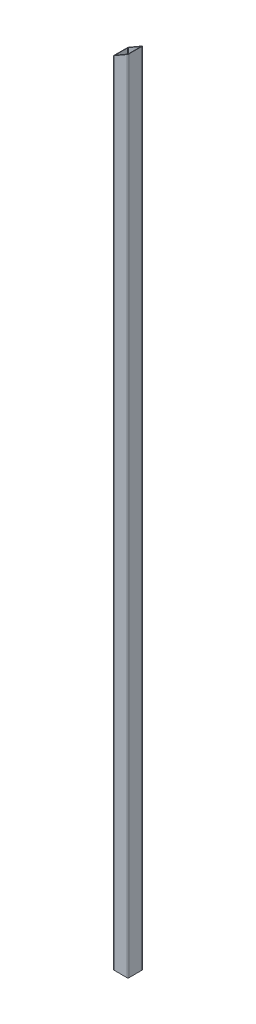
ISO-10303-21;
HEADER;
FILE_DESCRIPTION(('STEP AP214'),'2;1');
FILE_NAME('part.step','',(''),(''),'','','');
FILE_SCHEMA(('AUTOMOTIVE_DESIGN { 1 0 10303 214 1 1 1 1 }'));
ENDSEC;
DATA;
#1=APPLICATION_CONTEXT('core data for automotive mechanical design processes');
#2=APPLICATION_PROTOCOL_DEFINITION('international standard','automotive_design',2000,#1);
#3=PRODUCT_CONTEXT('',#1,'mechanical');
#4=PRODUCT('Part','Part','',(#3));
#5=PRODUCT_RELATED_PRODUCT_CATEGORY('part','',(#4));
#6=PRODUCT_DEFINITION_FORMATION('','',#4);
#7=PRODUCT_DEFINITION_CONTEXT('part definition',#1,'design');
#8=PRODUCT_DEFINITION('design','',#6,#7);
#9=PRODUCT_DEFINITION_SHAPE('','',#8);
#10=(LENGTH_UNIT() NAMED_UNIT(*) SI_UNIT(.MILLI.,.METRE.));
#11=(NAMED_UNIT(*) PLANE_ANGLE_UNIT() SI_UNIT($,.RADIAN.));
#12=(NAMED_UNIT(*) SI_UNIT($,.STERADIAN.) SOLID_ANGLE_UNIT());
#13=UNCERTAINTY_MEASURE_WITH_UNIT(LENGTH_MEASURE(1.E-05),#10,'distance_accuracy_value','');
#14=(GEOMETRIC_REPRESENTATION_CONTEXT(3) GLOBAL_UNCERTAINTY_ASSIGNED_CONTEXT((#13)) GLOBAL_UNIT_ASSIGNED_CONTEXT((#10,
#11,#12)) REPRESENTATION_CONTEXT('',''));
#15=CARTESIAN_POINT('',(0.,0.,0.));
#16=DIRECTION('',(0.,0.,1.));
#17=DIRECTION('',(1.,0.,0.));
#18=AXIS2_PLACEMENT_3D('',#15,#16,#17);
#19=CARTESIAN_POINT('',(2.99999999999979,-50.,47.));
#20=DIRECTION('',(0.,1.,0.));
#21=DIRECTION('',(0.,0.,1.));
#22=AXIS2_PLACEMENT_3D('',#19,#20,#21);
#23=CYLINDRICAL_SURFACE('',#22,3.);
#24=DIRECTION('',(0.,1.,0.));
#25=VECTOR('',#24,1.);
#26=CARTESIAN_POINT('',(2.99999999999979,-50.,50.));
#27=LINE('',#26,#25);
#28=CARTESIAN_POINT('',(2.99999999999979,-50.,50.));
#29=VERTEX_POINT('',#28);
#30=CARTESIAN_POINT('',(2.99999999999995,2625.27034153237,50.));
#31=VERTEX_POINT('',#30);
#32=EDGE_CURVE('E182',#29,#31,#27,.T.);
#33=ORIENTED_EDGE('',*,*,#32,.T.);
#34=CARTESIAN_POINT('',(2.99999999999979,2625.27034153237,47.));
#35=DIRECTION('',(-0.5,0.866025403784438,0.));
#36=DIRECTION('',(0.866025403784439,0.5,0.));
#37=AXIS2_PLACEMENT_3D('',#34,#35,#36);
#38=ELLIPSE('',#37,3.46410161513776,3.);
#39=CARTESIAN_POINT('',(-2.15105711021124E-13,2623.5382907248,47.));
#40=VERTEX_POINT('',#39);
#41=EDGE_CURVE('E48',#31,#40,#38,.F.);
#42=ORIENTED_EDGE('',*,*,#41,.T.);
#43=DIRECTION('',(0.,1.,0.));
#44=VECTOR('',#43,1.);
#45=CARTESIAN_POINT('',(-2.15105711021124E-13,-50.,47.));
#46=LINE('',#45,#44);
#47=CARTESIAN_POINT('',(-2.15105711021124E-13,-50.,47.));
#48=VERTEX_POINT('',#47);
#49=EDGE_CURVE('E41',#48,#40,#46,.T.);
#50=ORIENTED_EDGE('',*,*,#49,.F.);
#51=CARTESIAN_POINT('',(2.99999999999979,-50.,47.));
#52=DIRECTION('',(0.,1.,0.));
#53=DIRECTION('',(0.,0.,1.));
#54=AXIS2_PLACEMENT_3D('',#51,#52,#53);
#55=CIRCLE('',#54,3.);
#56=EDGE_CURVE('E197',#48,#29,#55,.T.);
#57=ORIENTED_EDGE('',*,*,#56,.T.);
#58=EDGE_LOOP('',(#33,#42,#50,#57));
#59=FACE_BOUND('',#58,.T.);
#60=ADVANCED_FACE('F34',(#59),#23,.T.);
#61=CARTESIAN_POINT('',(-2.15105711021124E-13,-50.,2.99999999999999));
#62=DIRECTION('',(-1.,0.,0.));
#63=DIRECTION('',(0.,0.,1.));
#64=AXIS2_PLACEMENT_3D('',#61,#62,#63);
#65=PLANE('',#64);
#66=ORIENTED_EDGE('',*,*,#49,.T.);
#67=DIRECTION('',(0.,0.,-1.));
#68=VECTOR('',#67,1.);
#69=CARTESIAN_POINT('',(-2.15105711021124E-13,2623.5382907248,2.99999999999999));
#70=LINE('',#69,#68);
#71=CARTESIAN_POINT('',(-2.15105711021124E-13,2623.5382907248,2.99999999999999));
#72=VERTEX_POINT('',#71);
#73=EDGE_CURVE('E162',#40,#72,#70,.T.);
#74=ORIENTED_EDGE('',*,*,#73,.T.);
#75=DIRECTION('',(0.,1.,0.));
#76=VECTOR('',#75,1.);
#77=CARTESIAN_POINT('',(-2.15105711021124E-13,-50.,2.99999999999999));
#78=LINE('',#77,#76);
#79=CARTESIAN_POINT('',(-2.15105711021124E-13,-50.,2.99999999999999));
#80=VERTEX_POINT('',#79);
#81=EDGE_CURVE('E161',#80,#72,#78,.T.);
#82=ORIENTED_EDGE('',*,*,#81,.F.);
#83=DIRECTION('',(0.,0.,1.));
#84=VECTOR('',#83,1.);
#85=CARTESIAN_POINT('',(-2.15105711021124E-13,-50.,2.99999999999999));
#86=LINE('',#85,#84);
#87=EDGE_CURVE('E184',#80,#48,#86,.T.);
#88=ORIENTED_EDGE('',*,*,#87,.T.);
#89=EDGE_LOOP('',(#66,#74,#82,#88));
#90=FACE_BOUND('',#89,.T.);
#91=ADVANCED_FACE('F195',(#90),#65,.T.);
#92=CARTESIAN_POINT('',(2.99999999999978,-50.,2.99999999999999));
#93=DIRECTION('',(0.,1.,0.));
#94=DIRECTION('',(0.,0.,1.));
#95=AXIS2_PLACEMENT_3D('',#92,#93,#94);
#96=CYLINDRICAL_SURFACE('',#95,3.);
#97=ORIENTED_EDGE('',*,*,#81,.T.);
#98=CARTESIAN_POINT('',(2.99999999999978,2625.27034153237,2.99999999999999));
#99=DIRECTION('',(-0.5,0.866025403784438,0.));
#100=DIRECTION('',(0.866025403784439,0.5,0.));
#101=AXIS2_PLACEMENT_3D('',#98,#99,#100);
#102=ELLIPSE('',#101,3.46410161513776,3.);
#103=CARTESIAN_POINT('',(2.99999999999967,2625.27034153237,0.));
#104=VERTEX_POINT('',#103);
#105=EDGE_CURVE('E146',#72,#104,#102,.F.);
#106=ORIENTED_EDGE('',*,*,#105,.T.);
#107=DIRECTION('',(0.,1.,0.));
#108=VECTOR('',#107,1.);
#109=CARTESIAN_POINT('',(2.99999999999978,-50.,0.));
#110=LINE('',#109,#108);
#111=CARTESIAN_POINT('',(2.99999999999978,-50.,0.));
#112=VERTEX_POINT('',#111);
#113=EDGE_CURVE('E159',#112,#104,#110,.T.);
#114=ORIENTED_EDGE('',*,*,#113,.F.);
#115=CARTESIAN_POINT('',(2.99999999999978,-50.,2.99999999999999));
#116=DIRECTION('',(0.,1.,0.));
#117=DIRECTION('',(0.,0.,1.));
#118=AXIS2_PLACEMENT_3D('',#115,#116,#117);
#119=CIRCLE('',#118,3.);
#120=EDGE_CURVE('E188',#112,#80,#119,.T.);
#121=ORIENTED_EDGE('',*,*,#120,.T.);
#122=EDGE_LOOP('',(#97,#106,#114,#121));
#123=FACE_BOUND('',#122,.T.);
#124=ADVANCED_FACE('F157',(#123),#96,.T.);
#125=CARTESIAN_POINT('',(2.99999999999978,-50.,0.));
#126=DIRECTION('',(0.,0.,-1.));
#127=DIRECTION('',(-1.,0.,0.));
#128=AXIS2_PLACEMENT_3D('',#125,#126,#127);
#129=PLANE('',#128);
#130=ORIENTED_EDGE('',*,*,#113,.T.);
#131=DIRECTION('',(0.866025403784438,0.5,0.));
#132=VECTOR('',#131,1.);
#133=CARTESIAN_POINT('',(-1130.00000000001,1971.13248654052,0.));
#134=LINE('',#133,#132);
#135=CARTESIAN_POINT('',(46.9999999999998,2650.67375337671,0.));
#136=VERTEX_POINT('',#135);
#137=EDGE_CURVE('E143',#104,#136,#134,.T.);
#138=ORIENTED_EDGE('',*,*,#137,.T.);
#139=DIRECTION('',(0.,1.,0.));
#140=VECTOR('',#139,1.);
#141=CARTESIAN_POINT('',(46.9999999999998,-50.,0.));
#142=LINE('',#141,#140);
#143=CARTESIAN_POINT('',(46.9999999999998,-50.,0.));
#144=VERTEX_POINT('',#143);
#145=EDGE_CURVE('E168',#144,#136,#142,.T.);
#146=ORIENTED_EDGE('',*,*,#145,.F.);
#147=DIRECTION('',(-1.,0.,0.));
#148=VECTOR('',#147,1.);
#149=CARTESIAN_POINT('',(2.99999999999978,-50.,0.));
#150=LINE('',#149,#148);
#151=EDGE_CURVE('E167',#144,#112,#150,.T.);
#152=ORIENTED_EDGE('',*,*,#151,.T.);
#153=EDGE_LOOP('',(#130,#138,#146,#152));
#154=FACE_BOUND('',#153,.T.);
#155=ADVANCED_FACE('F165',(#154),#129,.T.);
#156=CARTESIAN_POINT('',(46.9999999999998,-50.,2.99999999999999));
#157=DIRECTION('',(0.,1.,0.));
#158=DIRECTION('',(0.,0.,1.));
#159=AXIS2_PLACEMENT_3D('',#156,#157,#158);
#160=CYLINDRICAL_SURFACE('',#159,3.00000000000001);
#161=ORIENTED_EDGE('',*,*,#145,.T.);
#162=CARTESIAN_POINT('',(46.9999999999998,2650.67375337671,2.99999999999999));
#163=DIRECTION('',(-0.5,0.866025403784438,0.));
#164=DIRECTION('',(0.866025403784439,0.5,0.));
#165=AXIS2_PLACEMENT_3D('',#162,#163,#164);
#166=ELLIPSE('',#165,3.46410161513776,3.00000000000001);
#167=CARTESIAN_POINT('',(49.9999999999998,2652.40580418428,2.99999999999999));
#168=VERTEX_POINT('',#167);
#169=EDGE_CURVE('E149',#136,#168,#166,.F.);
#170=ORIENTED_EDGE('',*,*,#169,.T.);
#171=DIRECTION('',(0.,1.,0.));
#172=VECTOR('',#171,1.);
#173=CARTESIAN_POINT('',(49.9999999999998,-50.,2.99999999999999));
#174=LINE('',#173,#172);
#175=CARTESIAN_POINT('',(49.9999999999998,-50.,2.99999999999999));
#176=VERTEX_POINT('',#175);
#177=EDGE_CURVE('E171',#176,#168,#174,.T.);
#178=ORIENTED_EDGE('',*,*,#177,.F.);
#179=CARTESIAN_POINT('',(46.9999999999998,-50.,2.99999999999999));
#180=DIRECTION('',(0.,1.,0.));
#181=DIRECTION('',(0.,0.,-1.));
#182=AXIS2_PLACEMENT_3D('',#179,#180,#181);
#183=CIRCLE('',#182,3.00000000000001);
#184=EDGE_CURVE('E220',#176,#144,#183,.T.);
#185=ORIENTED_EDGE('',*,*,#184,.T.);
#186=EDGE_LOOP('',(#161,#170,#178,#185));
#187=FACE_BOUND('',#186,.T.);
#188=ADVANCED_FACE('F224',(#187),#160,.T.);
#189=CARTESIAN_POINT('',(49.9999999999998,-50.,2.99999999999999));
#190=DIRECTION('',(1.,0.,0.));
#191=DIRECTION('',(0.,0.,-1.));
#192=AXIS2_PLACEMENT_3D('',#189,#190,#191);
#193=PLANE('',#192);
#194=ORIENTED_EDGE('',*,*,#177,.T.);
#195=DIRECTION('',(0.,0.,1.));
#196=VECTOR('',#195,1.);
#197=CARTESIAN_POINT('',(49.9999999999998,2652.40580418428,2.99999999999999));
#198=LINE('',#197,#196);
#199=CARTESIAN_POINT('',(49.9999999999998,2652.40580418428,47.));
#200=VERTEX_POINT('',#199);
#201=EDGE_CURVE('E229',#168,#200,#198,.T.);
#202=ORIENTED_EDGE('',*,*,#201,.T.);
#203=DIRECTION('',(0.,1.,0.));
#204=VECTOR('',#203,1.);
#205=CARTESIAN_POINT('',(49.9999999999998,-50.,47.));
#206=LINE('',#205,#204);
#207=CARTESIAN_POINT('',(49.9999999999998,-50.,47.));
#208=VERTEX_POINT('',#207);
#209=EDGE_CURVE('E177',#208,#200,#206,.T.);
#210=ORIENTED_EDGE('',*,*,#209,.F.);
#211=DIRECTION('',(0.,0.,-1.));
#212=VECTOR('',#211,1.);
#213=CARTESIAN_POINT('',(49.9999999999998,-50.,2.99999999999999));
#214=LINE('',#213,#212);
#215=EDGE_CURVE('E217',#208,#176,#214,.T.);
#216=ORIENTED_EDGE('',*,*,#215,.T.);
#217=EDGE_LOOP('',(#194,#202,#210,#216));
#218=FACE_BOUND('',#217,.T.);
#219=ADVANCED_FACE('F227',(#218),#193,.T.);
#220=CARTESIAN_POINT('',(46.9999999999998,-50.,47.));
#221=DIRECTION('',(0.,1.,0.));
#222=DIRECTION('',(0.,0.,1.));
#223=AXIS2_PLACEMENT_3D('',#220,#221,#222);
#224=CYLINDRICAL_SURFACE('',#223,3.);
#225=ORIENTED_EDGE('',*,*,#209,.T.);
#226=CARTESIAN_POINT('',(46.9999999999998,2650.67375337671,47.));
#227=DIRECTION('',(-0.5,0.866025403784438,0.));
#228=DIRECTION('',(0.866025403784439,0.5,0.));
#229=AXIS2_PLACEMENT_3D('',#226,#227,#228);
#230=ELLIPSE('',#229,3.46410161513775,3.);
#231=CARTESIAN_POINT('',(46.9999999999997,2650.67375337671,50.));
#232=VERTEX_POINT('',#231);
#233=EDGE_CURVE('E233',#200,#232,#230,.F.);
#234=ORIENTED_EDGE('',*,*,#233,.T.);
#235=DIRECTION('',(0.,1.,0.));
#236=VECTOR('',#235,1.);
#237=CARTESIAN_POINT('',(46.9999999999998,-50.,50.));
#238=LINE('',#237,#236);
#239=CARTESIAN_POINT('',(46.9999999999998,-50.,50.));
#240=VERTEX_POINT('',#239);
#241=EDGE_CURVE('E180',#240,#232,#238,.T.);
#242=ORIENTED_EDGE('',*,*,#241,.F.);
#243=CARTESIAN_POINT('',(46.9999999999998,-50.,47.));
#244=DIRECTION('',(0.,1.,0.));
#245=DIRECTION('',(0.,0.,1.));
#246=AXIS2_PLACEMENT_3D('',#243,#244,#245);
#247=CIRCLE('',#246,3.);
#248=EDGE_CURVE('E206',#240,#208,#247,.T.);
#249=ORIENTED_EDGE('',*,*,#248,.T.);
#250=EDGE_LOOP('',(#225,#234,#242,#249));
#251=FACE_BOUND('',#250,.T.);
#252=ADVANCED_FACE('F232',(#251),#224,.T.);
#253=CARTESIAN_POINT('',(2.99999999999979,-50.,50.));
#254=DIRECTION('',(0.,0.,1.));
#255=DIRECTION('',(1.,0.,0.));
#256=AXIS2_PLACEMENT_3D('',#253,#254,#255);
#257=PLANE('',#256);
#258=ORIENTED_EDGE('',*,*,#241,.T.);
#259=DIRECTION('',(0.866025403784438,0.5,0.));
#260=VECTOR('',#259,1.);
#261=CARTESIAN_POINT('',(-1130.00000000001,1971.13248654052,50.));
#262=LINE('',#261,#260);
#263=EDGE_CURVE('E153',#31,#232,#262,.T.);
#264=ORIENTED_EDGE('',*,*,#263,.F.);
#265=ORIENTED_EDGE('',*,*,#32,.F.);
#266=DIRECTION('',(1.,0.,0.));
#267=VECTOR('',#266,1.);
#268=CARTESIAN_POINT('',(2.99999999999979,-50.,50.));
#269=LINE('',#268,#267);
#270=EDGE_CURVE('E203',#29,#240,#269,.T.);
#271=ORIENTED_EDGE('',*,*,#270,.T.);
#272=EDGE_LOOP('',(#258,#264,#265,#271));
#273=FACE_BOUND('',#272,.T.);
#274=ADVANCED_FACE('F235',(#273),#257,.T.);
#275=CARTESIAN_POINT('',(4.9999999999998,-50.,45.));
#276=DIRECTION('',(0.,1.,0.));
#277=DIRECTION('',(0.,0.,1.));
#278=AXIS2_PLACEMENT_3D('',#275,#276,#277);
#279=CYLINDRICAL_SURFACE('',#278,2.);
#280=CARTESIAN_POINT('',(4.9999999999998,2626.42504207075,45.));
#281=DIRECTION('',(-0.5,0.866025403784438,0.));
#282=DIRECTION('',(0.866025403784439,0.5,0.));
#283=AXIS2_PLACEMENT_3D('',#280,#281,#282);
#284=ELLIPSE('',#283,2.30940107675851,2.);
#285=CARTESIAN_POINT('',(4.99999999999967,2626.42504207075,47.));
#286=VERTEX_POINT('',#285);
#287=CARTESIAN_POINT('',(2.99999999999979,2625.27034153237,45.));
#288=VERTEX_POINT('',#287);
#289=EDGE_CURVE('E249',#286,#288,#284,.F.);
#290=ORIENTED_EDGE('',*,*,#289,.F.);
#291=DIRECTION('',(0.,1.,0.));
#292=VECTOR('',#291,1.);
#293=CARTESIAN_POINT('',(4.9999999999998,-50.,47.));
#294=LINE('',#293,#292);
#295=CARTESIAN_POINT('',(4.9999999999998,-50.,47.));
#296=VERTEX_POINT('',#295);
#297=EDGE_CURVE('E212',#296,#286,#294,.T.);
#298=ORIENTED_EDGE('',*,*,#297,.F.);
#299=CARTESIAN_POINT('',(4.9999999999998,-50.,45.));
#300=DIRECTION('',(0.,1.,0.));
#301=DIRECTION('',(0.,0.,1.));
#302=AXIS2_PLACEMENT_3D('',#299,#300,#301);
#303=CIRCLE('',#302,2.);
#304=CARTESIAN_POINT('',(2.99999999999979,-50.,45.));
#305=VERTEX_POINT('',#304);
#306=EDGE_CURVE('E256',#305,#296,#303,.T.);
#307=ORIENTED_EDGE('',*,*,#306,.F.);
#308=DIRECTION('',(0.,1.,0.));
#309=VECTOR('',#308,1.);
#310=CARTESIAN_POINT('',(2.99999999999979,-50.,45.));
#311=LINE('',#310,#309);
#312=EDGE_CURVE('E204',#305,#288,#311,.T.);
#313=ORIENTED_EDGE('',*,*,#312,.T.);
#314=EDGE_LOOP('',(#290,#298,#307,#313));
#315=FACE_BOUND('',#314,.T.);
#316=ADVANCED_FACE('F304',(#315),#279,.F.);
#317=CARTESIAN_POINT('',(2.99999999999979,-50.,5.));
#318=DIRECTION('',(-1.,0.,0.));
#319=DIRECTION('',(0.,0.,1.));
#320=AXIS2_PLACEMENT_3D('',#317,#318,#319);
#321=PLANE('',#320);
#322=DIRECTION('',(0.,0.,-1.));
#323=VECTOR('',#322,1.);
#324=CARTESIAN_POINT('',(2.99999999999979,2625.27034153237,5.));
#325=LINE('',#324,#323);
#326=CARTESIAN_POINT('',(2.99999999999979,2625.27034153237,5.));
#327=VERTEX_POINT('',#326);
#328=EDGE_CURVE('E247',#288,#327,#325,.T.);
#329=ORIENTED_EDGE('',*,*,#328,.F.);
#330=ORIENTED_EDGE('',*,*,#312,.F.);
#331=DIRECTION('',(0.,0.,1.));
#332=VECTOR('',#331,1.);
#333=CARTESIAN_POINT('',(2.99999999999979,-50.,5.));
#334=LINE('',#333,#332);
#335=CARTESIAN_POINT('',(2.99999999999979,-50.,5.));
#336=VERTEX_POINT('',#335);
#337=EDGE_CURVE('E277',#336,#305,#334,.T.);
#338=ORIENTED_EDGE('',*,*,#337,.F.);
#339=DIRECTION('',(0.,1.,0.));
#340=VECTOR('',#339,1.);
#341=CARTESIAN_POINT('',(2.99999999999979,-50.,5.));
#342=LINE('',#341,#340);
#343=EDGE_CURVE('E209',#336,#327,#342,.T.);
#344=ORIENTED_EDGE('',*,*,#343,.T.);
#345=EDGE_LOOP('',(#329,#330,#338,#344));
#346=FACE_BOUND('',#345,.T.);
#347=ADVANCED_FACE('F308',(#346),#321,.F.);
#348=CARTESIAN_POINT('',(4.9999999999998,-50.,5.));
#349=DIRECTION('',(0.,1.,0.));
#350=DIRECTION('',(0.,0.,1.));
#351=AXIS2_PLACEMENT_3D('',#348,#349,#350);
#352=CYLINDRICAL_SURFACE('',#351,2.);
#353=CARTESIAN_POINT('',(4.9999999999998,2626.42504207075,5.));
#354=DIRECTION('',(-0.5,0.866025403784438,0.));
#355=DIRECTION('',(0.866025403784439,0.5,0.));
#356=AXIS2_PLACEMENT_3D('',#353,#354,#355);
#357=ELLIPSE('',#356,2.30940107675851,2.);
#358=CARTESIAN_POINT('',(4.99999999999967,2626.42504207075,3.));
#359=VERTEX_POINT('',#358);
#360=EDGE_CURVE('E245',#327,#359,#357,.F.);
#361=ORIENTED_EDGE('',*,*,#360,.F.);
#362=ORIENTED_EDGE('',*,*,#343,.F.);
#363=CARTESIAN_POINT('',(4.9999999999998,-50.,5.));
#364=DIRECTION('',(0.,1.,0.));
#365=DIRECTION('',(0.,0.,1.));
#366=AXIS2_PLACEMENT_3D('',#363,#364,#365);
#367=CIRCLE('',#366,2.);
#368=CARTESIAN_POINT('',(4.9999999999998,-50.,3.));
#369=VERTEX_POINT('',#368);
#370=EDGE_CURVE('E274',#369,#336,#367,.T.);
#371=ORIENTED_EDGE('',*,*,#370,.F.);
#372=DIRECTION('',(0.,1.,0.));
#373=VECTOR('',#372,1.);
#374=CARTESIAN_POINT('',(4.9999999999998,-50.,3.));
#375=LINE('',#374,#373);
#376=EDGE_CURVE('E282',#369,#359,#375,.T.);
#377=ORIENTED_EDGE('',*,*,#376,.T.);
#378=EDGE_LOOP('',(#361,#362,#371,#377));
#379=FACE_BOUND('',#378,.T.);
#380=ADVANCED_FACE('F312',(#379),#352,.F.);
#381=CARTESIAN_POINT('',(4.9999999999998,-50.,3.));
#382=DIRECTION('',(0.,0.,-1.));
#383=DIRECTION('',(-1.,0.,0.));
#384=AXIS2_PLACEMENT_3D('',#381,#382,#383);
#385=PLANE('',#384);
#386=DIRECTION('',(0.866025403784439,0.5,0.));
#387=VECTOR('',#386,1.);
#388=CARTESIAN_POINT('',(-1153.92603887905,1957.31878155306,3.));
#389=LINE('',#388,#387);
#390=CARTESIAN_POINT('',(44.9999999999998,2649.51905283833,3.));
#391=VERTEX_POINT('',#390);
#392=EDGE_CURVE('E243',#359,#391,#389,.T.);
#393=ORIENTED_EDGE('',*,*,#392,.F.);
#394=ORIENTED_EDGE('',*,*,#376,.F.);
#395=DIRECTION('',(-1.,0.,0.));
#396=VECTOR('',#395,1.);
#397=CARTESIAN_POINT('',(4.9999999999998,-50.,3.));
#398=LINE('',#397,#396);
#399=CARTESIAN_POINT('',(44.9999999999998,-50.,3.));
#400=VERTEX_POINT('',#399);
#401=EDGE_CURVE('E271',#400,#369,#398,.T.);
#402=ORIENTED_EDGE('',*,*,#401,.F.);
#403=DIRECTION('',(0.,1.,0.));
#404=VECTOR('',#403,1.);
#405=CARTESIAN_POINT('',(44.9999999999998,-50.,3.));
#406=LINE('',#405,#404);
#407=EDGE_CURVE('E285',#400,#391,#406,.T.);
#408=ORIENTED_EDGE('',*,*,#407,.T.);
#409=EDGE_LOOP('',(#393,#394,#402,#408));
#410=FACE_BOUND('',#409,.T.);
#411=ADVANCED_FACE('F316',(#410),#385,.F.);
#412=CARTESIAN_POINT('',(44.9999999999998,-50.,5.));
#413=DIRECTION('',(0.,1.,0.));
#414=DIRECTION('',(0.,0.,1.));
#415=AXIS2_PLACEMENT_3D('',#412,#413,#414);
#416=CYLINDRICAL_SURFACE('',#415,2.);
#417=CARTESIAN_POINT('',(44.9999999999998,2649.51905283833,5.));
#418=DIRECTION('',(-0.5,0.866025403784438,0.));
#419=DIRECTION('',(0.866025403784439,0.5,0.));
#420=AXIS2_PLACEMENT_3D('',#417,#418,#419);
#421=ELLIPSE('',#420,2.30940107675851,2.);
#422=CARTESIAN_POINT('',(46.9999999999998,2650.67375337671,5.));
#423=VERTEX_POINT('',#422);
#424=EDGE_CURVE('E241',#391,#423,#421,.F.);
#425=ORIENTED_EDGE('',*,*,#424,.F.);
#426=ORIENTED_EDGE('',*,*,#407,.F.);
#427=CARTESIAN_POINT('',(44.9999999999998,-50.,5.));
#428=DIRECTION('',(0.,1.,0.));
#429=DIRECTION('',(0.,0.,-1.));
#430=AXIS2_PLACEMENT_3D('',#427,#428,#429);
#431=CIRCLE('',#430,2.);
#432=CARTESIAN_POINT('',(46.9999999999998,-50.,5.));
#433=VERTEX_POINT('',#432);
#434=EDGE_CURVE('E268',#433,#400,#431,.T.);
#435=ORIENTED_EDGE('',*,*,#434,.F.);
#436=DIRECTION('',(0.,1.,0.));
#437=VECTOR('',#436,1.);
#438=CARTESIAN_POINT('',(46.9999999999998,-50.,5.));
#439=LINE('',#438,#437);
#440=EDGE_CURVE('E288',#433,#423,#439,.T.);
#441=ORIENTED_EDGE('',*,*,#440,.T.);
#442=EDGE_LOOP('',(#425,#426,#435,#441));
#443=FACE_BOUND('',#442,.T.);
#444=ADVANCED_FACE('F320',(#443),#416,.F.);
#445=CARTESIAN_POINT('',(46.9999999999998,-50.,5.));
#446=DIRECTION('',(1.,0.,0.));
#447=DIRECTION('',(0.,0.,-1.));
#448=AXIS2_PLACEMENT_3D('',#445,#446,#447);
#449=PLANE('',#448);
#450=DIRECTION('',(0.,0.,1.));
#451=VECTOR('',#450,1.);
#452=CARTESIAN_POINT('',(46.9999999999998,2650.67375337671,5.));
#453=LINE('',#452,#451);
#454=CARTESIAN_POINT('',(46.9999999999998,2650.67375337671,45.));
#455=VERTEX_POINT('',#454);
#456=EDGE_CURVE('E237',#423,#455,#453,.T.);
#457=ORIENTED_EDGE('',*,*,#456,.F.);
#458=ORIENTED_EDGE('',*,*,#440,.F.);
#459=DIRECTION('',(0.,0.,-1.));
#460=VECTOR('',#459,1.);
#461=CARTESIAN_POINT('',(46.9999999999998,-50.,5.));
#462=LINE('',#461,#460);
#463=CARTESIAN_POINT('',(46.9999999999998,-50.,45.));
#464=VERTEX_POINT('',#463);
#465=EDGE_CURVE('E265',#464,#433,#462,.T.);
#466=ORIENTED_EDGE('',*,*,#465,.F.);
#467=DIRECTION('',(0.,1.,0.));
#468=VECTOR('',#467,1.);
#469=CARTESIAN_POINT('',(46.9999999999998,-50.,45.));
#470=LINE('',#469,#468);
#471=EDGE_CURVE('E291',#464,#455,#470,.T.);
#472=ORIENTED_EDGE('',*,*,#471,.T.);
#473=EDGE_LOOP('',(#457,#458,#466,#472));
#474=FACE_BOUND('',#473,.T.);
#475=ADVANCED_FACE('F323',(#474),#449,.F.);
#476=CARTESIAN_POINT('',(44.9999999999998,-50.,45.));
#477=DIRECTION('',(0.,1.,0.));
#478=DIRECTION('',(0.,0.,1.));
#479=AXIS2_PLACEMENT_3D('',#476,#477,#478);
#480=CYLINDRICAL_SURFACE('',#479,2.);
#481=CARTESIAN_POINT('',(44.9999999999998,2649.51905283833,45.));
#482=DIRECTION('',(-0.5,0.866025403784438,0.));
#483=DIRECTION('',(0.866025403784439,0.5,0.));
#484=AXIS2_PLACEMENT_3D('',#481,#482,#483);
#485=ELLIPSE('',#484,2.30940107675851,2.);
#486=CARTESIAN_POINT('',(44.9999999999999,2649.51905283833,47.));
#487=VERTEX_POINT('',#486);
#488=EDGE_CURVE('E55',#455,#487,#485,.F.);
#489=ORIENTED_EDGE('',*,*,#488,.F.);
#490=ORIENTED_EDGE('',*,*,#471,.F.);
#491=CARTESIAN_POINT('',(44.9999999999998,-50.,45.));
#492=DIRECTION('',(0.,1.,0.));
#493=DIRECTION('',(0.,0.,1.));
#494=AXIS2_PLACEMENT_3D('',#491,#492,#493);
#495=CIRCLE('',#494,2.);
#496=CARTESIAN_POINT('',(44.9999999999998,-50.,47.));
#497=VERTEX_POINT('',#496);
#498=EDGE_CURVE('E262',#497,#464,#495,.T.);
#499=ORIENTED_EDGE('',*,*,#498,.F.);
#500=DIRECTION('',(0.,1.,0.));
#501=VECTOR('',#500,1.);
#502=CARTESIAN_POINT('',(44.9999999999998,-50.,47.));
#503=LINE('',#502,#501);
#504=EDGE_CURVE('E293',#497,#487,#503,.T.);
#505=ORIENTED_EDGE('',*,*,#504,.T.);
#506=EDGE_LOOP('',(#489,#490,#499,#505));
#507=FACE_BOUND('',#506,.T.);
#508=ADVANCED_FACE('F325',(#507),#480,.F.);
#509=CARTESIAN_POINT('',(4.9999999999998,-50.,47.));
#510=DIRECTION('',(0.,0.,1.));
#511=DIRECTION('',(1.,0.,0.));
#512=AXIS2_PLACEMENT_3D('',#509,#510,#511);
#513=PLANE('',#512);
#514=DIRECTION('',(-0.866025403784439,-0.5,0.));
#515=VECTOR('',#514,1.);
#516=CARTESIAN_POINT('',(-1153.92603887905,1957.31878155306,47.));
#517=LINE('',#516,#515);
#518=EDGE_CURVE('E11',#487,#286,#517,.T.);
#519=ORIENTED_EDGE('',*,*,#518,.F.);
#520=ORIENTED_EDGE('',*,*,#504,.F.);
#521=DIRECTION('',(1.,0.,0.));
#522=VECTOR('',#521,1.);
#523=CARTESIAN_POINT('',(4.9999999999998,-50.,47.));
#524=LINE('',#523,#522);
#525=EDGE_CURVE('E259',#296,#497,#524,.T.);
#526=ORIENTED_EDGE('',*,*,#525,.F.);
#527=ORIENTED_EDGE('',*,*,#297,.T.);
#528=EDGE_LOOP('',(#519,#520,#526,#527));
#529=FACE_BOUND('',#528,.T.);
#530=ADVANCED_FACE('F300',(#529),#513,.F.);
#531=CARTESIAN_POINT('',(2.99999999999979,-50.,47.));
#532=DIRECTION('',(0.,1.,0.));
#533=DIRECTION('',(0.,0.,1.));
#534=AXIS2_PLACEMENT_3D('',#531,#532,#533);
#535=PLANE('',#534);
#536=ORIENTED_EDGE('',*,*,#337,.T.);
#537=ORIENTED_EDGE('',*,*,#306,.T.);
#538=ORIENTED_EDGE('',*,*,#525,.T.);
#539=ORIENTED_EDGE('',*,*,#498,.T.);
#540=ORIENTED_EDGE('',*,*,#465,.T.);
#541=ORIENTED_EDGE('',*,*,#434,.T.);
#542=ORIENTED_EDGE('',*,*,#401,.T.);
#543=ORIENTED_EDGE('',*,*,#370,.T.);
#544=EDGE_LOOP('',(#536,#537,#538,#539,#540,#541,#542,#543));
#545=FACE_BOUND('',#544,.T.);
#546=ORIENTED_EDGE('',*,*,#56,.F.);
#547=ORIENTED_EDGE('',*,*,#87,.F.);
#548=ORIENTED_EDGE('',*,*,#120,.F.);
#549=ORIENTED_EDGE('',*,*,#151,.F.);
#550=ORIENTED_EDGE('',*,*,#184,.F.);
#551=ORIENTED_EDGE('',*,*,#215,.F.);
#552=ORIENTED_EDGE('',*,*,#248,.F.);
#553=ORIENTED_EDGE('',*,*,#270,.F.);
#554=EDGE_LOOP('',(#546,#547,#548,#549,#550,#551,#552,#553));
#555=FACE_BOUND('',#554,.T.);
#556=ADVANCED_FACE('F200',(#545,#555),#535,.F.);
#557=CARTESIAN_POINT('',(-1130.00000000001,1971.13248654052,50.));
#558=DIRECTION('',(-0.5,0.866025403784438,0.));
#559=DIRECTION('',(-0.866025403784439,-0.5,0.));
#560=AXIS2_PLACEMENT_3D('',#557,#558,#559);
#561=PLANE('',#560);
#562=ORIENTED_EDGE('',*,*,#263,.T.);
#563=ORIENTED_EDGE('',*,*,#233,.F.);
#564=ORIENTED_EDGE('',*,*,#201,.F.);
#565=ORIENTED_EDGE('',*,*,#169,.F.);
#566=ORIENTED_EDGE('',*,*,#137,.F.);
#567=ORIENTED_EDGE('',*,*,#105,.F.);
#568=ORIENTED_EDGE('',*,*,#73,.F.);
#569=ORIENTED_EDGE('',*,*,#41,.F.);
#570=EDGE_LOOP('',(#562,#563,#564,#565,#566,#567,#568,#569));
#571=FACE_BOUND('',#570,.T.);
#572=ORIENTED_EDGE('',*,*,#289,.T.);
#573=ORIENTED_EDGE('',*,*,#328,.T.);
#574=ORIENTED_EDGE('',*,*,#360,.T.);
#575=ORIENTED_EDGE('',*,*,#392,.T.);
#576=ORIENTED_EDGE('',*,*,#424,.T.);
#577=ORIENTED_EDGE('',*,*,#456,.T.);
#578=ORIENTED_EDGE('',*,*,#488,.T.);
#579=ORIENTED_EDGE('',*,*,#518,.T.);
#580=EDGE_LOOP('',(#572,#573,#574,#575,#576,#577,#578,#579));
#581=FACE_BOUND('',#580,.T.);
#582=ADVANCED_FACE('F145',(#571,#581),#561,.T.);
#583=CLOSED_SHELL('',(#60,#91,#124,#155,#188,#219,#252,#274,#316,#347,#380,#411,#444,#475,#508,
#530,#556,#582));
#584=MANIFOLD_SOLID_BREP('B2',#583);
#585=ADVANCED_BREP_SHAPE_REPRESENTATION('',(#18,#584),#14);
#586=SHAPE_DEFINITION_REPRESENTATION(#9,#585);
ENDSEC;
END-ISO-10303-21;
